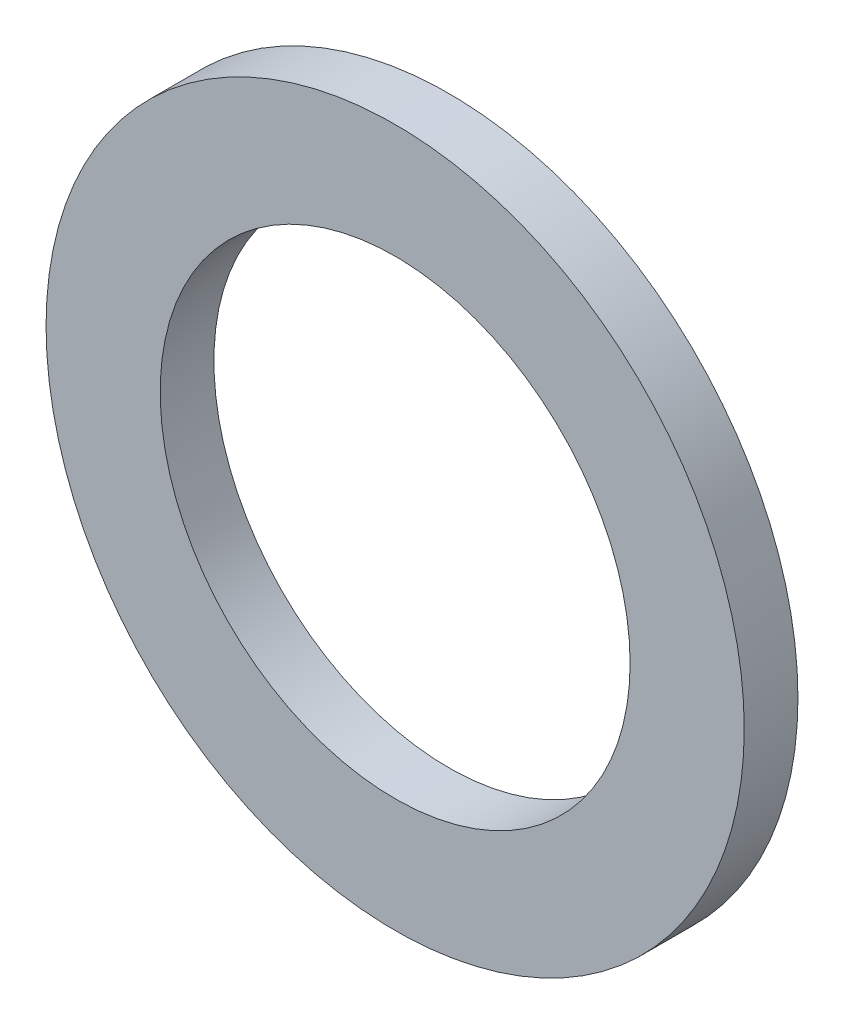
ISO-10303-21;
HEADER;
FILE_DESCRIPTION(('STEP AP214'),'2;1');
FILE_NAME('part.step','',(''),(''),'','','');
FILE_SCHEMA(('AUTOMOTIVE_DESIGN { 1 0 10303 214 1 1 1 1 }'));
ENDSEC;
DATA;
#1=APPLICATION_CONTEXT('core data for automotive mechanical design processes');
#2=APPLICATION_PROTOCOL_DEFINITION('international standard','automotive_design',2000,#1);
#3=PRODUCT_CONTEXT('',#1,'mechanical');
#4=PRODUCT('Part','Part','',(#3));
#5=PRODUCT_RELATED_PRODUCT_CATEGORY('part','',(#4));
#6=PRODUCT_DEFINITION_FORMATION('','',#4);
#7=PRODUCT_DEFINITION_CONTEXT('part definition',#1,'design');
#8=PRODUCT_DEFINITION('design','',#6,#7);
#9=PRODUCT_DEFINITION_SHAPE('','',#8);
#10=(LENGTH_UNIT() NAMED_UNIT(*) SI_UNIT(.MILLI.,.METRE.));
#11=(NAMED_UNIT(*) PLANE_ANGLE_UNIT() SI_UNIT($,.RADIAN.));
#12=(NAMED_UNIT(*) SI_UNIT($,.STERADIAN.) SOLID_ANGLE_UNIT());
#13=UNCERTAINTY_MEASURE_WITH_UNIT(LENGTH_MEASURE(1.E-05),#10,'distance_accuracy_value','');
#14=(GEOMETRIC_REPRESENTATION_CONTEXT(3) GLOBAL_UNCERTAINTY_ASSIGNED_CONTEXT((#13)) GLOBAL_UNIT_ASSIGNED_CONTEXT((#10,
#11,#12)) REPRESENTATION_CONTEXT('',''));
#15=CARTESIAN_POINT('',(0.,0.,0.));
#16=DIRECTION('',(0.,0.,1.));
#17=DIRECTION('',(1.,0.,0.));
#18=AXIS2_PLACEMENT_3D('',#15,#16,#17);
#19=CARTESIAN_POINT('',(0.,0.,4.));
#20=DIRECTION('',(0.,0.,1.));
#21=DIRECTION('',(1.,0.,0.));
#22=AXIS2_PLACEMENT_3D('',#19,#20,#21);
#23=PLANE('',#22);
#24=CARTESIAN_POINT('',(0.,0.,4.));
#25=DIRECTION('',(0.,0.,1.));
#26=DIRECTION('',(1.,0.,0.));
#27=AXIS2_PLACEMENT_3D('',#24,#25,#26);
#28=CIRCLE('',#27,26.);
#29=CARTESIAN_POINT('',(26.,0.,4.));
#30=VERTEX_POINT('',#29);
#31=EDGE_CURVE('E10',#30,#30,#28,.T.);
#32=ORIENTED_EDGE('',*,*,#31,.T.);
#33=EDGE_LOOP('',(#32));
#34=FACE_BOUND('',#33,.T.);
#35=CARTESIAN_POINT('',(0.,0.,4.));
#36=DIRECTION('',(0.,0.,1.));
#37=DIRECTION('',(1.,0.,0.));
#38=AXIS2_PLACEMENT_3D('',#35,#36,#37);
#39=CIRCLE('',#38,17.5);
#40=CARTESIAN_POINT('',(17.5,0.,4.));
#41=VERTEX_POINT('',#40);
#42=EDGE_CURVE('E46',#41,#41,#39,.T.);
#43=ORIENTED_EDGE('',*,*,#42,.F.);
#44=EDGE_LOOP('',(#43));
#45=FACE_BOUND('',#44,.T.);
#46=ADVANCED_FACE('F35',(#34,#45),#23,.T.);
#47=CARTESIAN_POINT('',(0.,0.,0.));
#48=DIRECTION('',(0.,0.,1.));
#49=DIRECTION('',(1.,0.,0.));
#50=AXIS2_PLACEMENT_3D('',#47,#48,#49);
#51=PLANE('',#50);
#52=CARTESIAN_POINT('',(0.,0.,0.));
#53=DIRECTION('',(0.,0.,1.));
#54=DIRECTION('',(1.,0.,0.));
#55=AXIS2_PLACEMENT_3D('',#52,#53,#54);
#56=CIRCLE('',#55,26.);
#57=CARTESIAN_POINT('',(26.,0.,0.));
#58=VERTEX_POINT('',#57);
#59=EDGE_CURVE('E39',#58,#58,#56,.T.);
#60=ORIENTED_EDGE('',*,*,#59,.F.);
#61=EDGE_LOOP('',(#60));
#62=FACE_BOUND('',#61,.T.);
#63=CARTESIAN_POINT('',(0.,0.,0.));
#64=DIRECTION('',(0.,0.,1.));
#65=DIRECTION('',(1.,0.,0.));
#66=AXIS2_PLACEMENT_3D('',#63,#64,#65);
#67=CIRCLE('',#66,17.5);
#68=CARTESIAN_POINT('',(17.5,0.,0.));
#69=VERTEX_POINT('',#68);
#70=EDGE_CURVE('E48',#69,#69,#67,.T.);
#71=ORIENTED_EDGE('',*,*,#70,.T.);
#72=EDGE_LOOP('',(#71));
#73=FACE_BOUND('',#72,.T.);
#74=ADVANCED_FACE('F58',(#62,#73),#51,.F.);
#75=CARTESIAN_POINT('',(0.,0.,4.));
#76=DIRECTION('',(0.,0.,-1.));
#77=DIRECTION('',(-1.,0.,0.));
#78=AXIS2_PLACEMENT_3D('',#75,#76,#77);
#79=CYLINDRICAL_SURFACE('',#78,26.);
#80=ORIENTED_EDGE('',*,*,#31,.F.);
#81=EDGE_LOOP('',(#80));
#82=FACE_BOUND('',#81,.T.);
#83=ORIENTED_EDGE('',*,*,#59,.T.);
#84=EDGE_LOOP('',(#83));
#85=FACE_BOUND('',#84,.T.);
#86=ADVANCED_FACE('F37',(#82,#85),#79,.T.);
#87=CARTESIAN_POINT('',(0.,0.,4.));
#88=DIRECTION('',(0.,0.,-1.));
#89=DIRECTION('',(-1.,0.,0.));
#90=AXIS2_PLACEMENT_3D('',#87,#88,#89);
#91=CYLINDRICAL_SURFACE('',#90,17.5);
#92=ORIENTED_EDGE('',*,*,#42,.T.);
#93=EDGE_LOOP('',(#92));
#94=FACE_BOUND('',#93,.T.);
#95=ORIENTED_EDGE('',*,*,#70,.F.);
#96=EDGE_LOOP('',(#95));
#97=FACE_BOUND('',#96,.T.);
#98=ADVANCED_FACE('F54',(#94,#97),#91,.F.);
#99=CLOSED_SHELL('',(#46,#74,#86,#98));
#100=MANIFOLD_SOLID_BREP('B2',#99);
#101=ADVANCED_BREP_SHAPE_REPRESENTATION('',(#18,#100),#14);
#102=SHAPE_DEFINITION_REPRESENTATION(#9,#101);
ENDSEC;
END-ISO-10303-21;
